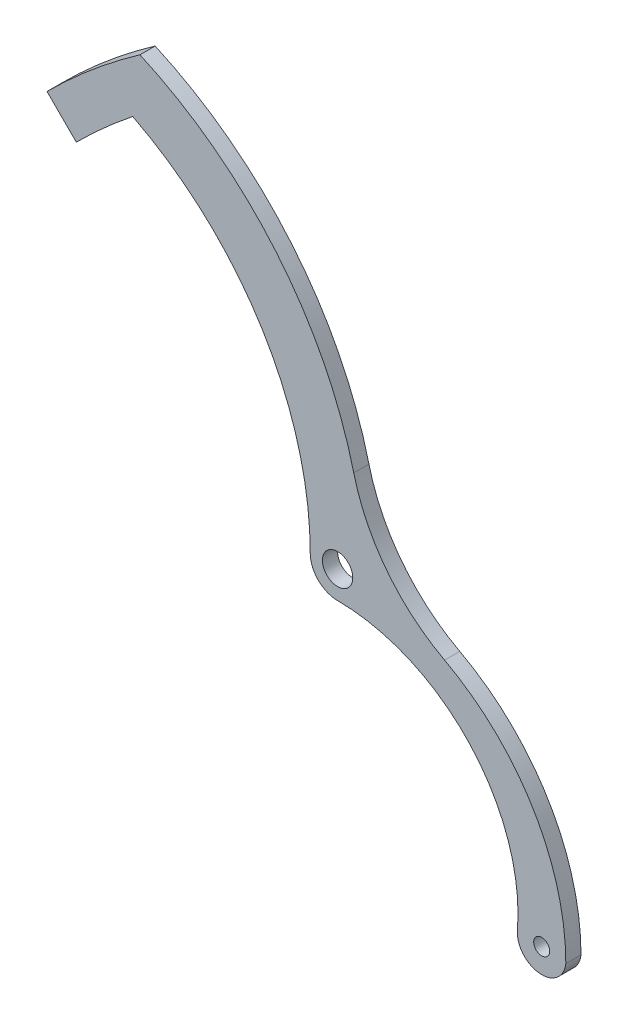
ISO-10303-21;
HEADER;
FILE_DESCRIPTION(('STEP AP214'),'2;1');
FILE_NAME('part.step','',(''),(''),'','','');
FILE_SCHEMA(('AUTOMOTIVE_DESIGN { 1 0 10303 214 1 1 1 1 }'));
ENDSEC;
DATA;
#1=APPLICATION_CONTEXT('core data for automotive mechanical design processes');
#2=APPLICATION_PROTOCOL_DEFINITION('international standard','automotive_design',2000,#1);
#3=PRODUCT_CONTEXT('',#1,'mechanical');
#4=PRODUCT('Part','Part','',(#3));
#5=PRODUCT_RELATED_PRODUCT_CATEGORY('part','',(#4));
#6=PRODUCT_DEFINITION_FORMATION('','',#4);
#7=PRODUCT_DEFINITION_CONTEXT('part definition',#1,'design');
#8=PRODUCT_DEFINITION('design','',#6,#7);
#9=PRODUCT_DEFINITION_SHAPE('','',#8);
#10=(LENGTH_UNIT() NAMED_UNIT(*) SI_UNIT(.MILLI.,.METRE.));
#11=(NAMED_UNIT(*) PLANE_ANGLE_UNIT() SI_UNIT($,.RADIAN.));
#12=(NAMED_UNIT(*) SI_UNIT($,.STERADIAN.) SOLID_ANGLE_UNIT());
#13=UNCERTAINTY_MEASURE_WITH_UNIT(LENGTH_MEASURE(1.E-05),#10,'distance_accuracy_value','');
#14=(GEOMETRIC_REPRESENTATION_CONTEXT(3) GLOBAL_UNCERTAINTY_ASSIGNED_CONTEXT((#13)) GLOBAL_UNIT_ASSIGNED_CONTEXT((#10,
#11,#12)) REPRESENTATION_CONTEXT('',''));
#15=CARTESIAN_POINT('',(0.,0.,0.));
#16=DIRECTION('',(0.,0.,1.));
#17=DIRECTION('',(1.,0.,0.));
#18=AXIS2_PLACEMENT_3D('',#15,#16,#17);
#19=CARTESIAN_POINT('',(-67.6557455046024,-0.953123177998443,5.));
#20=DIRECTION('',(0.,0.,-1.));
#21=DIRECTION('',(-1.,0.,0.));
#22=AXIS2_PLACEMENT_3D('',#19,#20,#21);
#23=CYLINDRICAL_SURFACE('',#22,75.6070239132935);
#24=CARTESIAN_POINT('',(-67.6557455046024,-0.953123177998443,0.));
#25=DIRECTION('',(0.,0.,1.));
#26=DIRECTION('',(1.,0.,0.));
#27=AXIS2_PLACEMENT_3D('',#24,#25,#26);
#28=CIRCLE('',#27,75.6070239132935);
#29=CARTESIAN_POINT('',(-31.962523765119,65.6983283206854,0.));
#30=VERTEX_POINT('',#29);
#31=CARTESIAN_POINT('',(7.95124483943299,-0.881876127019217,0.));
#32=VERTEX_POINT('',#31);
#33=EDGE_CURVE('E146',#30,#32,#28,.F.);
#34=ORIENTED_EDGE('',*,*,#33,.F.);
#35=DIRECTION('',(0.,0.,-1.));
#36=VECTOR('',#35,1.);
#37=CARTESIAN_POINT('',(-31.962523765119,65.6983283206854,5.));
#38=LINE('',#37,#36);
#39=CARTESIAN_POINT('',(-31.962523765119,65.6983283206854,5.));
#40=VERTEX_POINT('',#39);
#41=EDGE_CURVE('E11',#40,#30,#38,.T.);
#42=ORIENTED_EDGE('',*,*,#41,.F.);
#43=CARTESIAN_POINT('',(-67.6557455046024,-0.953123177998443,5.));
#44=DIRECTION('',(0.,0.,1.));
#45=DIRECTION('',(1.,0.,0.));
#46=AXIS2_PLACEMENT_3D('',#43,#44,#45);
#47=CIRCLE('',#46,75.6070239132935);
#48=CARTESIAN_POINT('',(7.95124483943299,-0.881876127019217,5.));
#49=VERTEX_POINT('',#48);
#50=EDGE_CURVE('E175',#40,#49,#47,.F.);
#51=ORIENTED_EDGE('',*,*,#50,.T.);
#52=DIRECTION('',(0.,0.,-1.));
#53=VECTOR('',#52,1.);
#54=CARTESIAN_POINT('',(7.95124483943299,-0.881876127019217,5.));
#55=LINE('',#54,#53);
#56=EDGE_CURVE('E92',#49,#32,#55,.T.);
#57=ORIENTED_EDGE('',*,*,#56,.T.);
#58=EDGE_LOOP('',(#34,#42,#51,#57));
#59=FACE_BOUND('',#58,.T.);
#60=ADVANCED_FACE('F35',(#59),#23,.T.);
#61=CARTESIAN_POINT('',(-3.63720167831147,118.591391463962,5.));
#62=DIRECTION('',(0.,0.,-1.));
#63=DIRECTION('',(-1.,0.,0.));
#64=AXIS2_PLACEMENT_3D('',#61,#62,#63);
#65=CYLINDRICAL_SURFACE('',#64,60.);
#66=CARTESIAN_POINT('',(-3.63720167831147,118.591391463962,0.));
#67=DIRECTION('',(0.,0.,1.));
#68=DIRECTION('',(1.,0.,0.));
#69=AXIS2_PLACEMENT_3D('',#66,#67,#68);
#70=CIRCLE('',#69,60.);
#71=CARTESIAN_POINT('',(-61.8713554515231,104.14205465157,0.));
#72=VERTEX_POINT('',#71);
#73=EDGE_CURVE('E149',#30,#72,#70,.F.);
#74=ORIENTED_EDGE('',*,*,#73,.T.);
#75=DIRECTION('',(0.,0.,-1.));
#76=VECTOR('',#75,1.);
#77=CARTESIAN_POINT('',(-61.8713554515231,104.14205465157,5.));
#78=LINE('',#77,#76);
#79=CARTESIAN_POINT('',(-61.8713554515231,104.14205465157,5.));
#80=VERTEX_POINT('',#79);
#81=EDGE_CURVE('E43',#80,#72,#78,.T.);
#82=ORIENTED_EDGE('',*,*,#81,.F.);
#83=CARTESIAN_POINT('',(-3.63720167831147,118.591391463962,5.));
#84=DIRECTION('',(0.,0.,1.));
#85=DIRECTION('',(1.,0.,0.));
#86=AXIS2_PLACEMENT_3D('',#83,#84,#85);
#87=CIRCLE('',#86,60.);
#88=EDGE_CURVE('E213',#40,#80,#87,.F.);
#89=ORIENTED_EDGE('',*,*,#88,.F.);
#90=ORIENTED_EDGE('',*,*,#41,.T.);
#91=EDGE_LOOP('',(#74,#82,#89,#90));
#92=FACE_BOUND('',#91,.T.);
#93=ADVANCED_FACE('F225',(#92),#65,.F.);
#94=CARTESIAN_POINT('',(-183.110365644585,74.0596514642082,5.));
#95=DIRECTION('',(0.,0.,-1.));
#96=DIRECTION('',(-1.,0.,0.));
#97=AXIS2_PLACEMENT_3D('',#94,#95,#96);
#98=CYLINDRICAL_SURFACE('',#97,124.915365644585);
#99=CARTESIAN_POINT('',(-183.110365644585,74.0596514642082,0.));
#100=DIRECTION('',(0.,0.,1.));
#101=DIRECTION('',(1.,0.,0.));
#102=AXIS2_PLACEMENT_3D('',#99,#100,#101);
#103=CIRCLE('',#102,124.915365644585);
#104=CARTESIAN_POINT('',(-132.270242638709,188.16105578014,0.));
#105=VERTEX_POINT('',#104);
#106=EDGE_CURVE('E151',#72,#105,#103,.T.);
#107=ORIENTED_EDGE('',*,*,#106,.T.);
#108=DIRECTION('',(0.,0.,-1.));
#109=VECTOR('',#108,1.);
#110=CARTESIAN_POINT('',(-132.270242638709,188.16105578014,5.));
#111=LINE('',#110,#109);
#112=CARTESIAN_POINT('',(-132.270242638709,188.16105578014,5.));
#113=VERTEX_POINT('',#112);
#114=EDGE_CURVE('E186',#113,#105,#111,.T.);
#115=ORIENTED_EDGE('',*,*,#114,.F.);
#116=CARTESIAN_POINT('',(-183.110365644585,74.0596514642082,5.));
#117=DIRECTION('',(0.,0.,1.));
#118=DIRECTION('',(1.,0.,0.));
#119=AXIS2_PLACEMENT_3D('',#116,#117,#118);
#120=CIRCLE('',#119,124.915365644585);
#121=EDGE_CURVE('E194',#80,#113,#120,.T.);
#122=ORIENTED_EDGE('',*,*,#121,.F.);
#123=ORIENTED_EDGE('',*,*,#81,.T.);
#124=EDGE_LOOP('',(#107,#115,#122,#123));
#125=FACE_BOUND('',#124,.T.);
#126=ADVANCED_FACE('F192',(#125),#98,.T.);
#127=CARTESIAN_POINT('',(1.58206781009085E-12,-2.35922392732846E-12,5.));
#128=DIRECTION('',(0.,0.,-1.));
#129=DIRECTION('',(-1.,0.,0.));
#130=AXIS2_PLACEMENT_3D('',#127,#128,#129);
#131=CYLINDRICAL_SURFACE('',#130,230.000000000003);
#132=CARTESIAN_POINT('',(1.58206781009085E-12,-2.35922392732846E-12,0.));
#133=DIRECTION('',(0.,0.,1.));
#134=DIRECTION('',(1.,0.,0.));
#135=AXIS2_PLACEMENT_3D('',#132,#133,#134);
#136=CIRCLE('',#135,230.000000000003);
#137=CARTESIAN_POINT('',(-162.872207873527,162.396563702569,0.));
#138=VERTEX_POINT('',#137);
#139=EDGE_CURVE('E154',#138,#105,#136,.F.);
#140=ORIENTED_EDGE('',*,*,#139,.F.);
#141=DIRECTION('',(0.,0.,-1.));
#142=VECTOR('',#141,1.);
#143=CARTESIAN_POINT('',(-162.872207873527,162.396563702569,5.));
#144=LINE('',#143,#142);
#145=CARTESIAN_POINT('',(-162.872207873527,162.396563702569,5.));
#146=VERTEX_POINT('',#145);
#147=EDGE_CURVE('E184',#146,#138,#144,.T.);
#148=ORIENTED_EDGE('',*,*,#147,.F.);
#149=CARTESIAN_POINT('',(1.58206781009085E-12,-2.35922392732846E-12,5.));
#150=DIRECTION('',(0.,0.,1.));
#151=DIRECTION('',(1.,0.,0.));
#152=AXIS2_PLACEMENT_3D('',#149,#150,#151);
#153=CIRCLE('',#152,230.000000000003);
#154=EDGE_CURVE('E208',#146,#113,#153,.F.);
#155=ORIENTED_EDGE('',*,*,#154,.T.);
#156=ORIENTED_EDGE('',*,*,#114,.T.);
#157=EDGE_LOOP('',(#140,#148,#155,#156));
#158=FACE_BOUND('',#157,.T.);
#159=ADVANCED_FACE('F204',(#158),#131,.T.);
#160=CARTESIAN_POINT('',(1.27383329013792E-13,1.27756422732903E-13,5.));
#161=DIRECTION('',(0.706072016098127,0.708140034232726,0.));
#162=DIRECTION('',(-0.708140034232726,0.706072016098127,0.));
#163=AXIS2_PLACEMENT_3D('',#160,#161,#162);
#164=PLANE('',#163);
#165=DIRECTION('',(0.708140034232726,-0.706072016098127,0.));
#166=VECTOR('',#165,1.);
#167=CARTESIAN_POINT('',(1.27383329013792E-13,1.27756422732903E-13,0.));
#168=LINE('',#167,#166);
#169=CARTESIAN_POINT('',(-153.22004952066,152.772593049235,0.));
#170=VERTEX_POINT('',#169);
#171=EDGE_CURVE('E157',#138,#170,#168,.T.);
#172=ORIENTED_EDGE('',*,*,#171,.T.);
#173=DIRECTION('',(0.,0.,-1.));
#174=VECTOR('',#173,1.);
#175=CARTESIAN_POINT('',(-153.22004952066,152.772593049235,5.));
#176=LINE('',#175,#174);
#177=CARTESIAN_POINT('',(-153.22004952066,152.772593049235,5.));
#178=VERTEX_POINT('',#177);
#179=EDGE_CURVE('E181',#178,#170,#176,.T.);
#180=ORIENTED_EDGE('',*,*,#179,.F.);
#181=DIRECTION('',(0.708140034232726,-0.706072016098127,0.));
#182=VECTOR('',#181,1.);
#183=CARTESIAN_POINT('',(1.27383329013792E-13,1.27756422732903E-13,5.));
#184=LINE('',#183,#182);
#185=EDGE_CURVE('E209',#146,#178,#184,.T.);
#186=ORIENTED_EDGE('',*,*,#185,.F.);
#187=ORIENTED_EDGE('',*,*,#147,.T.);
#188=EDGE_LOOP('',(#172,#180,#186,#187));
#189=FACE_BOUND('',#188,.T.);
#190=ADVANCED_FACE('F235',(#189),#164,.F.);
#191=CARTESIAN_POINT('',(1.58206781009085E-12,-2.35922392732846E-12,5.));
#192=DIRECTION('',(0.,0.,-1.));
#193=DIRECTION('',(-1.,0.,0.));
#194=AXIS2_PLACEMENT_3D('',#191,#192,#193);
#195=CYLINDRICAL_SURFACE('',#194,216.369703891513);
#196=CARTESIAN_POINT('',(1.58206781009085E-12,-2.35922392732846E-12,0.));
#197=DIRECTION('',(0.,0.,1.));
#198=DIRECTION('',(1.,0.,0.));
#199=AXIS2_PLACEMENT_3D('',#196,#197,#198);
#200=CIRCLE('',#199,216.369703891513);
#201=CARTESIAN_POINT('',(-134.654137313092,169.363845216643,0.));
#202=VERTEX_POINT('',#201);
#203=EDGE_CURVE('E159',#170,#202,#200,.F.);
#204=ORIENTED_EDGE('',*,*,#203,.T.);
#205=DIRECTION('',(0.,0.,-1.));
#206=VECTOR('',#205,1.);
#207=CARTESIAN_POINT('',(-134.654137313092,169.363845216643,5.));
#208=LINE('',#207,#206);
#209=CARTESIAN_POINT('',(-134.654137313092,169.363845216643,5.));
#210=VERTEX_POINT('',#209);
#211=EDGE_CURVE('E179',#210,#202,#208,.T.);
#212=ORIENTED_EDGE('',*,*,#211,.F.);
#213=CARTESIAN_POINT('',(1.58206781009085E-12,-2.35922392732846E-12,5.));
#214=DIRECTION('',(0.,0.,1.));
#215=DIRECTION('',(1.,0.,0.));
#216=AXIS2_PLACEMENT_3D('',#213,#214,#215);
#217=CIRCLE('',#216,216.369703891513);
#218=EDGE_CURVE('E211',#178,#210,#217,.F.);
#219=ORIENTED_EDGE('',*,*,#218,.F.);
#220=ORIENTED_EDGE('',*,*,#179,.T.);
#221=EDGE_LOOP('',(#204,#212,#219,#220));
#222=FACE_BOUND('',#221,.T.);
#223=ADVANCED_FACE('F238',(#222),#195,.F.);
#224=CARTESIAN_POINT('',(-183.110365644585,74.0596514642082,5.));
#225=DIRECTION('',(0.,0.,-1.));
#226=DIRECTION('',(-1.,0.,0.));
#227=AXIS2_PLACEMENT_3D('',#224,#225,#226);
#228=CYLINDRICAL_SURFACE('',#227,106.915365644585);
#229=CARTESIAN_POINT('',(-183.110365644585,74.0596514642082,0.));
#230=DIRECTION('',(0.,0.,1.));
#231=DIRECTION('',(1.,0.,0.));
#232=AXIS2_PLACEMENT_3D('',#229,#230,#231);
#233=CIRCLE('',#232,106.915365644585);
#234=CARTESIAN_POINT('',(-76.195,74.0596514642082,0.));
#235=VERTEX_POINT('',#234);
#236=EDGE_CURVE('E162',#235,#202,#233,.T.);
#237=ORIENTED_EDGE('',*,*,#236,.F.);
#238=DIRECTION('',(0.,0.,-1.));
#239=VECTOR('',#238,1.);
#240=CARTESIAN_POINT('',(-76.195,74.0596514642082,5.));
#241=LINE('',#240,#239);
#242=CARTESIAN_POINT('',(-76.195,74.0596514642082,5.));
#243=VERTEX_POINT('',#242);
#244=EDGE_CURVE('E132',#243,#235,#241,.T.);
#245=ORIENTED_EDGE('',*,*,#244,.F.);
#246=CARTESIAN_POINT('',(-183.110365644585,74.0596514642082,5.));
#247=DIRECTION('',(0.,0.,1.));
#248=DIRECTION('',(1.,0.,0.));
#249=AXIS2_PLACEMENT_3D('',#246,#247,#248);
#250=CIRCLE('',#249,106.915365644585);
#251=EDGE_CURVE('E125',#243,#210,#250,.T.);
#252=ORIENTED_EDGE('',*,*,#251,.T.);
#253=ORIENTED_EDGE('',*,*,#211,.T.);
#254=EDGE_LOOP('',(#237,#245,#252,#253));
#255=FACE_BOUND('',#254,.T.);
#256=ADVANCED_FACE('F219',(#255),#228,.F.);
#257=CARTESIAN_POINT('',(-67.195,74.0596514642082,5.));
#258=DIRECTION('',(0.,0.,-1.));
#259=DIRECTION('',(-1.,0.,0.));
#260=AXIS2_PLACEMENT_3D('',#257,#258,#259);
#261=CYLINDRICAL_SURFACE('',#260,9.00000000000001);
#262=CARTESIAN_POINT('',(-67.195,74.0596514642082,0.));
#263=DIRECTION('',(0.,0.,1.));
#264=DIRECTION('',(1.,0.,0.));
#265=AXIS2_PLACEMENT_3D('',#262,#263,#264);
#266=CIRCLE('',#265,9.00000000000001);
#267=CARTESIAN_POINT('',(-67.230563194257,65.0597217278595,0.));
#268=VERTEX_POINT('',#267);
#269=EDGE_CURVE('E131',#235,#268,#266,.T.);
#270=ORIENTED_EDGE('',*,*,#269,.T.);
#271=DIRECTION('',(0.,0.,-1.));
#272=VECTOR('',#271,1.);
#273=CARTESIAN_POINT('',(-67.230563194257,65.0597217278595,5.));
#274=LINE('',#273,#272);
#275=CARTESIAN_POINT('',(-67.230563194257,65.0597217278595,5.));
#276=VERTEX_POINT('',#275);
#277=EDGE_CURVE('E128',#276,#268,#274,.T.);
#278=ORIENTED_EDGE('',*,*,#277,.F.);
#279=CARTESIAN_POINT('',(-67.195,74.0596514642082,5.));
#280=DIRECTION('',(0.,0.,1.));
#281=DIRECTION('',(1.,0.,0.));
#282=AXIS2_PLACEMENT_3D('',#279,#280,#281);
#283=CIRCLE('',#282,9.00000000000001);
#284=EDGE_CURVE('E118',#243,#276,#283,.T.);
#285=ORIENTED_EDGE('',*,*,#284,.F.);
#286=ORIENTED_EDGE('',*,*,#244,.T.);
#287=EDGE_LOOP('',(#270,#278,#285,#286));
#288=FACE_BOUND('',#287,.T.);
#289=ADVANCED_FACE('F129',(#288),#261,.T.);
#290=CARTESIAN_POINT('',(-67.4663887862913,5.3796563488893,5.));
#291=DIRECTION('',(0.,0.,-1.));
#292=DIRECTION('',(-1.,0.,0.));
#293=AXIS2_PLACEMENT_3D('',#290,#291,#292);
#294=CYLINDRICAL_SURFACE('',#293,59.6805313091967);
#295=CARTESIAN_POINT('',(-67.4663887862913,5.3796563488893,0.));
#296=DIRECTION('',(0.,0.,1.));
#297=DIRECTION('',(1.,0.,0.));
#298=AXIS2_PLACEMENT_3D('',#295,#296,#297);
#299=CIRCLE('',#298,59.6805313091967);
#300=CARTESIAN_POINT('',(-7.97468784375257,0.635888193524272,0.));
#301=VERTEX_POINT('',#300);
#302=EDGE_CURVE('E85',#268,#301,#299,.F.);
#303=ORIENTED_EDGE('',*,*,#302,.T.);
#304=DIRECTION('',(0.,0.,-1.));
#305=VECTOR('',#304,1.);
#306=CARTESIAN_POINT('',(-7.97468784375257,0.635888193524272,5.));
#307=LINE('',#306,#305);
#308=CARTESIAN_POINT('',(-7.97468784375257,0.635888193524272,5.));
#309=VERTEX_POINT('',#308);
#310=EDGE_CURVE('E133',#309,#301,#307,.T.);
#311=ORIENTED_EDGE('',*,*,#310,.F.);
#312=CARTESIAN_POINT('',(-67.4663887862913,5.3796563488893,5.));
#313=DIRECTION('',(0.,0.,1.));
#314=DIRECTION('',(1.,0.,0.));
#315=AXIS2_PLACEMENT_3D('',#312,#313,#314);
#316=CIRCLE('',#315,59.6805313091967);
#317=EDGE_CURVE('E123',#276,#309,#316,.F.);
#318=ORIENTED_EDGE('',*,*,#317,.F.);
#319=ORIENTED_EDGE('',*,*,#277,.T.);
#320=EDGE_LOOP('',(#303,#311,#318,#319));
#321=FACE_BOUND('',#320,.T.);
#322=ADVANCED_FACE('F135',(#321),#294,.F.);
#323=CARTESIAN_POINT('',(1.58206781009085E-12,-2.35922392732846E-12,5.));
#324=DIRECTION('',(0.,0.,-1.));
#325=DIRECTION('',(-1.,0.,0.));
#326=AXIS2_PLACEMENT_3D('',#323,#324,#325);
#327=CYLINDRICAL_SURFACE('',#326,2.63024290190963);
#328=CARTESIAN_POINT('',(1.58206781009085E-12,-2.35922392732846E-12,5.));
#329=DIRECTION('',(0.,0.,1.));
#330=DIRECTION('',(1.,0.,0.));
#331=AXIS2_PLACEMENT_3D('',#328,#329,#330);
#332=CIRCLE('',#331,2.63024290190963);
#333=CARTESIAN_POINT('',(2.63024290191121,-2.35922392732846E-12,5.));
#334=VERTEX_POINT('',#333);
#335=EDGE_CURVE('E137',#334,#334,#332,.T.);
#336=ORIENTED_EDGE('',*,*,#335,.T.);
#337=EDGE_LOOP('',(#336));
#338=FACE_BOUND('',#337,.T.);
#339=CARTESIAN_POINT('',(1.58206781009085E-12,-2.35922392732846E-12,0.));
#340=DIRECTION('',(0.,0.,1.));
#341=DIRECTION('',(1.,0.,0.));
#342=AXIS2_PLACEMENT_3D('',#339,#340,#341);
#343=CIRCLE('',#342,2.63024290190963);
#344=CARTESIAN_POINT('',(2.63024290191121,-2.35922392732846E-12,0.));
#345=VERTEX_POINT('',#344);
#346=EDGE_CURVE('E169',#345,#345,#343,.T.);
#347=ORIENTED_EDGE('',*,*,#346,.F.);
#348=EDGE_LOOP('',(#347));
#349=FACE_BOUND('',#348,.T.);
#350=ADVANCED_FACE('F249',(#338,#349),#327,.F.);
#351=CARTESIAN_POINT('',(1.58206781009085E-12,-2.35922392732846E-12,5.));
#352=DIRECTION('',(0.,0.,-1.));
#353=DIRECTION('',(-1.,0.,0.));
#354=AXIS2_PLACEMENT_3D('',#351,#352,#353);
#355=CYLINDRICAL_SURFACE('',#354,7.99999999999918);
#356=CARTESIAN_POINT('',(1.58206781009085E-12,-2.35922392732846E-12,0.));
#357=DIRECTION('',(0.,0.,1.));
#358=DIRECTION('',(1.,0.,0.));
#359=AXIS2_PLACEMENT_3D('',#356,#357,#358);
#360=CIRCLE('',#359,7.99999999999918);
#361=EDGE_CURVE('E167',#301,#32,#360,.T.);
#362=ORIENTED_EDGE('',*,*,#361,.T.);
#363=ORIENTED_EDGE('',*,*,#56,.F.);
#364=CARTESIAN_POINT('',(1.58206781009085E-12,-2.35922392732846E-12,5.));
#365=DIRECTION('',(0.,0.,1.));
#366=DIRECTION('',(1.,0.,0.));
#367=AXIS2_PLACEMENT_3D('',#364,#365,#366);
#368=CIRCLE('',#367,7.99999999999918);
#369=EDGE_CURVE('E51',#309,#49,#368,.T.);
#370=ORIENTED_EDGE('',*,*,#369,.F.);
#371=ORIENTED_EDGE('',*,*,#310,.T.);
#372=EDGE_LOOP('',(#362,#363,#370,#371));
#373=FACE_BOUND('',#372,.T.);
#374=ADVANCED_FACE('F223',(#373),#355,.T.);
#375=CARTESIAN_POINT('',(-67.195,74.0596514642082,5.));
#376=DIRECTION('',(0.,0.,-1.));
#377=DIRECTION('',(-1.,0.,0.));
#378=AXIS2_PLACEMENT_3D('',#375,#376,#377);
#379=CYLINDRICAL_SURFACE('',#378,5.00000000000001);
#380=CARTESIAN_POINT('',(-67.195,74.0596514642082,5.));
#381=DIRECTION('',(0.,0.,1.));
#382=DIRECTION('',(1.,0.,0.));
#383=AXIS2_PLACEMENT_3D('',#380,#381,#382);
#384=CIRCLE('',#383,5.00000000000001);
#385=CARTESIAN_POINT('',(-62.195,74.0596514642082,5.));
#386=VERTEX_POINT('',#385);
#387=EDGE_CURVE('E143',#386,#386,#384,.T.);
#388=ORIENTED_EDGE('',*,*,#387,.T.);
#389=EDGE_LOOP('',(#388));
#390=FACE_BOUND('',#389,.T.);
#391=CARTESIAN_POINT('',(-67.195,74.0596514642082,0.));
#392=DIRECTION('',(0.,0.,1.));
#393=DIRECTION('',(1.,0.,0.));
#394=AXIS2_PLACEMENT_3D('',#391,#392,#393);
#395=CIRCLE('',#394,5.00000000000001);
#396=CARTESIAN_POINT('',(-62.195,74.0596514642082,0.));
#397=VERTEX_POINT('',#396);
#398=EDGE_CURVE('E172',#397,#397,#395,.T.);
#399=ORIENTED_EDGE('',*,*,#398,.F.);
#400=EDGE_LOOP('',(#399));
#401=FACE_BOUND('',#400,.T.);
#402=ADVANCED_FACE('F252',(#390,#401),#379,.F.);
#403=CARTESIAN_POINT('',(0.,0.,5.));
#404=DIRECTION('',(0.,0.,1.));
#405=DIRECTION('',(1.,0.,0.));
#406=AXIS2_PLACEMENT_3D('',#403,#404,#405);
#407=PLANE('',#406);
#408=ORIENTED_EDGE('',*,*,#50,.F.);
#409=ORIENTED_EDGE('',*,*,#88,.T.);
#410=ORIENTED_EDGE('',*,*,#121,.T.);
#411=ORIENTED_EDGE('',*,*,#154,.F.);
#412=ORIENTED_EDGE('',*,*,#185,.T.);
#413=ORIENTED_EDGE('',*,*,#218,.T.);
#414=ORIENTED_EDGE('',*,*,#251,.F.);
#415=ORIENTED_EDGE('',*,*,#284,.T.);
#416=ORIENTED_EDGE('',*,*,#317,.T.);
#417=ORIENTED_EDGE('',*,*,#369,.T.);
#418=EDGE_LOOP('',(#408,#409,#410,#411,#412,#413,#414,#415,#416,#417));
#419=FACE_BOUND('',#418,.T.);
#420=ORIENTED_EDGE('',*,*,#335,.F.);
#421=EDGE_LOOP('',(#420));
#422=FACE_BOUND('',#421,.T.);
#423=ORIENTED_EDGE('',*,*,#387,.F.);
#424=EDGE_LOOP('',(#423));
#425=FACE_BOUND('',#424,.T.);
#426=ADVANCED_FACE('F120',(#419,#422,#425),#407,.T.);
#427=CARTESIAN_POINT('',(0.,0.,0.));
#428=DIRECTION('',(0.,0.,1.));
#429=DIRECTION('',(1.,0.,0.));
#430=AXIS2_PLACEMENT_3D('',#427,#428,#429);
#431=PLANE('',#430);
#432=ORIENTED_EDGE('',*,*,#33,.T.);
#433=ORIENTED_EDGE('',*,*,#361,.F.);
#434=ORIENTED_EDGE('',*,*,#302,.F.);
#435=ORIENTED_EDGE('',*,*,#269,.F.);
#436=ORIENTED_EDGE('',*,*,#236,.T.);
#437=ORIENTED_EDGE('',*,*,#203,.F.);
#438=ORIENTED_EDGE('',*,*,#171,.F.);
#439=ORIENTED_EDGE('',*,*,#139,.T.);
#440=ORIENTED_EDGE('',*,*,#106,.F.);
#441=ORIENTED_EDGE('',*,*,#73,.F.);
#442=EDGE_LOOP('',(#432,#433,#434,#435,#436,#437,#438,#439,#440,#441));
#443=FACE_BOUND('',#442,.T.);
#444=ORIENTED_EDGE('',*,*,#346,.T.);
#445=EDGE_LOOP('',(#444));
#446=FACE_BOUND('',#445,.T.);
#447=ORIENTED_EDGE('',*,*,#398,.T.);
#448=EDGE_LOOP('',(#447));
#449=FACE_BOUND('',#448,.T.);
#450=ADVANCED_FACE('F198',(#443,#446,#449),#431,.F.);
#451=CLOSED_SHELL('',(#60,#93,#126,#159,#190,#223,#256,#289,#322,#350,#374,#402,#426,#450));
#452=MANIFOLD_SOLID_BREP('B2',#451);
#453=ADVANCED_BREP_SHAPE_REPRESENTATION('',(#18,#452),#14);
#454=SHAPE_DEFINITION_REPRESENTATION(#9,#453);
ENDSEC;
END-ISO-10303-21;
